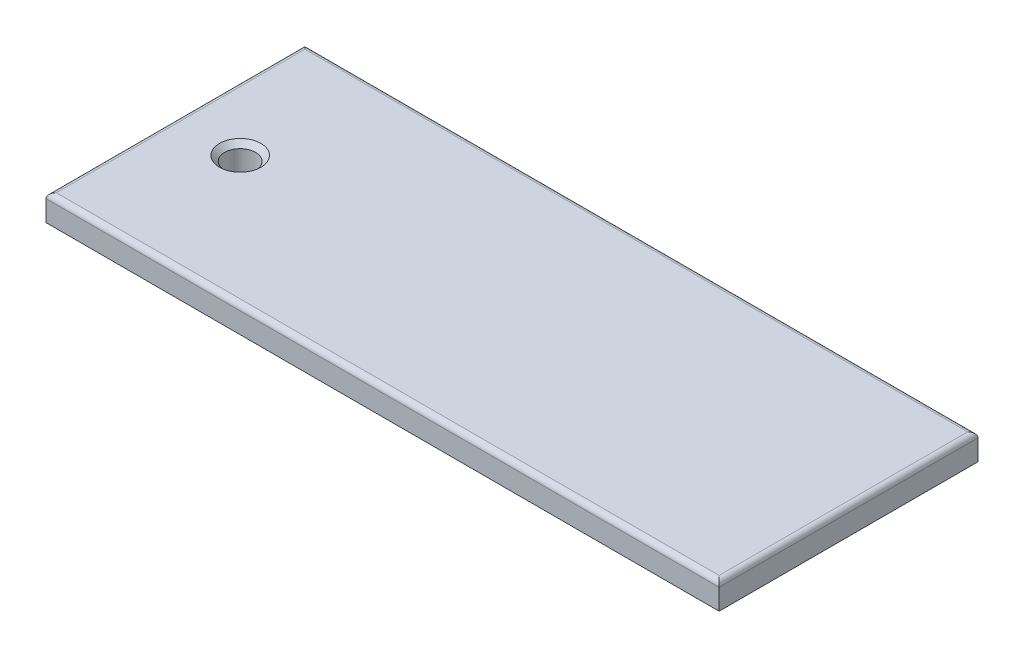
ISO-10303-21;
HEADER;
FILE_DESCRIPTION(('STEP AP214'),'2;1');
FILE_NAME('part.step','',(''),(''),'','','');
FILE_SCHEMA(('AUTOMOTIVE_DESIGN { 1 0 10303 214 1 1 1 1 }'));
ENDSEC;
DATA;
#1=APPLICATION_CONTEXT('core data for automotive mechanical design processes');
#2=APPLICATION_PROTOCOL_DEFINITION('international standard','automotive_design',2000,#1);
#3=PRODUCT_CONTEXT('',#1,'mechanical');
#4=PRODUCT('Part','Part','',(#3));
#5=PRODUCT_RELATED_PRODUCT_CATEGORY('part','',(#4));
#6=PRODUCT_DEFINITION_FORMATION('','',#4);
#7=PRODUCT_DEFINITION_CONTEXT('part definition',#1,'design');
#8=PRODUCT_DEFINITION('design','',#6,#7);
#9=PRODUCT_DEFINITION_SHAPE('','',#8);
#10=(LENGTH_UNIT() NAMED_UNIT(*) SI_UNIT(.MILLI.,.METRE.));
#11=(NAMED_UNIT(*) PLANE_ANGLE_UNIT() SI_UNIT($,.RADIAN.));
#12=(NAMED_UNIT(*) SI_UNIT($,.STERADIAN.) SOLID_ANGLE_UNIT());
#13=UNCERTAINTY_MEASURE_WITH_UNIT(LENGTH_MEASURE(1.E-05),#10,'distance_accuracy_value','');
#14=(GEOMETRIC_REPRESENTATION_CONTEXT(3) GLOBAL_UNCERTAINTY_ASSIGNED_CONTEXT((#13)) GLOBAL_UNIT_ASSIGNED_CONTEXT((#10,
#11,#12)) REPRESENTATION_CONTEXT('',''));
#15=CARTESIAN_POINT('',(0.,0.,0.));
#16=DIRECTION('',(0.,0.,1.));
#17=DIRECTION('',(1.,0.,0.));
#18=AXIS2_PLACEMENT_3D('',#15,#16,#17);
#19=CARTESIAN_POINT('',(-130.,10.,50.));
#20=DIRECTION('',(1.,0.,0.));
#21=DIRECTION('',(0.,0.,-1.));
#22=AXIS2_PLACEMENT_3D('',#19,#20,#21);
#23=PLANE('',#22);
#24=DIRECTION('',(0.,-1.,0.));
#25=VECTOR('',#24,1.);
#26=CARTESIAN_POINT('',(-130.,10.,50.));
#27=LINE('',#26,#25);
#28=CARTESIAN_POINT('',(-130.,8.,50.));
#29=VERTEX_POINT('',#28);
#30=CARTESIAN_POINT('',(-130.,0.,50.));
#31=VERTEX_POINT('',#30);
#32=EDGE_CURVE('E99',#29,#31,#27,.T.);
#33=ORIENTED_EDGE('',*,*,#32,.F.);
#34=DIRECTION('',(0.,0.,1.));
#35=VECTOR('',#34,1.);
#36=CARTESIAN_POINT('',(-130.,8.,-50.));
#37=LINE('',#36,#35);
#38=CARTESIAN_POINT('',(-130.,8.,-50.));
#39=VERTEX_POINT('',#38);
#40=EDGE_CURVE('E159',#29,#39,#37,.F.);
#41=ORIENTED_EDGE('',*,*,#40,.T.);
#42=DIRECTION('',(0.,-1.,0.));
#43=VECTOR('',#42,1.);
#44=CARTESIAN_POINT('',(-130.,10.,-50.));
#45=LINE('',#44,#43);
#46=CARTESIAN_POINT('',(-130.,0.,-50.));
#47=VERTEX_POINT('',#46);
#48=EDGE_CURVE('E123',#39,#47,#45,.T.);
#49=ORIENTED_EDGE('',*,*,#48,.T.);
#50=DIRECTION('',(0.,0.,1.));
#51=VECTOR('',#50,1.);
#52=CARTESIAN_POINT('',(-130.,0.,50.));
#53=LINE('',#52,#51);
#54=EDGE_CURVE('E118',#47,#31,#53,.T.);
#55=ORIENTED_EDGE('',*,*,#54,.T.);
#56=EDGE_LOOP('',(#33,#41,#49,#55));
#57=FACE_BOUND('',#56,.T.);
#58=ADVANCED_FACE('F44',(#57),#23,.F.);
#59=CARTESIAN_POINT('',(130.,10.,50.));
#60=DIRECTION('',(0.,0.,-1.));
#61=DIRECTION('',(-1.,0.,0.));
#62=AXIS2_PLACEMENT_3D('',#59,#60,#61);
#63=PLANE('',#62);
#64=DIRECTION('',(0.,-1.,0.));
#65=VECTOR('',#64,1.);
#66=CARTESIAN_POINT('',(130.,10.,50.));
#67=LINE('',#66,#65);
#68=CARTESIAN_POINT('',(130.,8.,50.));
#69=VERTEX_POINT('',#68);
#70=CARTESIAN_POINT('',(130.,0.,50.));
#71=VERTEX_POINT('',#70);
#72=EDGE_CURVE('E112',#69,#71,#67,.T.);
#73=ORIENTED_EDGE('',*,*,#72,.F.);
#74=DIRECTION('',(1.,0.,0.));
#75=VECTOR('',#74,1.);
#76=CARTESIAN_POINT('',(-130.,8.,50.));
#77=LINE('',#76,#75);
#78=EDGE_CURVE('E105',#69,#29,#77,.F.);
#79=ORIENTED_EDGE('',*,*,#78,.T.);
#80=ORIENTED_EDGE('',*,*,#32,.T.);
#81=DIRECTION('',(1.,0.,0.));
#82=VECTOR('',#81,1.);
#83=CARTESIAN_POINT('',(130.,0.,50.));
#84=LINE('',#83,#82);
#85=EDGE_CURVE('E102',#31,#71,#84,.T.);
#86=ORIENTED_EDGE('',*,*,#85,.T.);
#87=EDGE_LOOP('',(#73,#79,#80,#86));
#88=FACE_BOUND('',#87,.T.);
#89=ADVANCED_FACE('F101',(#88),#63,.F.);
#90=CARTESIAN_POINT('',(130.,10.,50.));
#91=DIRECTION('',(-1.,0.,0.));
#92=DIRECTION('',(0.,0.,1.));
#93=AXIS2_PLACEMENT_3D('',#90,#91,#92);
#94=PLANE('',#93);
#95=DIRECTION('',(0.,-1.,0.));
#96=VECTOR('',#95,1.);
#97=CARTESIAN_POINT('',(130.,10.,-50.));
#98=LINE('',#97,#96);
#99=CARTESIAN_POINT('',(130.,8.,-50.));
#100=VERTEX_POINT('',#99);
#101=CARTESIAN_POINT('',(130.,0.,-50.));
#102=VERTEX_POINT('',#101);
#103=EDGE_CURVE('E142',#100,#102,#98,.T.);
#104=ORIENTED_EDGE('',*,*,#103,.F.);
#105=DIRECTION('',(0.,0.,-1.));
#106=VECTOR('',#105,1.);
#107=CARTESIAN_POINT('',(130.,8.,50.));
#108=LINE('',#107,#106);
#109=EDGE_CURVE('E60',#100,#69,#108,.F.);
#110=ORIENTED_EDGE('',*,*,#109,.T.);
#111=ORIENTED_EDGE('',*,*,#72,.T.);
#112=DIRECTION('',(0.,0.,-1.));
#113=VECTOR('',#112,1.);
#114=CARTESIAN_POINT('',(130.,0.,50.));
#115=LINE('',#114,#113);
#116=EDGE_CURVE('E120',#71,#102,#115,.T.);
#117=ORIENTED_EDGE('',*,*,#116,.T.);
#118=EDGE_LOOP('',(#104,#110,#111,#117));
#119=FACE_BOUND('',#118,.T.);
#120=ADVANCED_FACE('F196',(#119),#94,.F.);
#121=CARTESIAN_POINT('',(130.,10.,-50.));
#122=DIRECTION('',(0.,0.,1.));
#123=DIRECTION('',(1.,0.,0.));
#124=AXIS2_PLACEMENT_3D('',#121,#122,#123);
#125=PLANE('',#124);
#126=ORIENTED_EDGE('',*,*,#48,.F.);
#127=DIRECTION('',(-1.,0.,0.));
#128=VECTOR('',#127,1.);
#129=CARTESIAN_POINT('',(130.,8.,-50.));
#130=LINE('',#129,#128);
#131=EDGE_CURVE('E68',#39,#100,#130,.F.);
#132=ORIENTED_EDGE('',*,*,#131,.T.);
#133=ORIENTED_EDGE('',*,*,#103,.T.);
#134=DIRECTION('',(-1.,0.,0.));
#135=VECTOR('',#134,1.);
#136=CARTESIAN_POINT('',(130.,0.,-50.));
#137=LINE('',#136,#135);
#138=EDGE_CURVE('E137',#102,#47,#137,.T.);
#139=ORIENTED_EDGE('',*,*,#138,.T.);
#140=EDGE_LOOP('',(#126,#132,#133,#139));
#141=FACE_BOUND('',#140,.T.);
#142=ADVANCED_FACE('F226',(#141),#125,.F.);
#143=CARTESIAN_POINT('',(0.,10.,0.));
#144=DIRECTION('',(0.,1.,0.));
#145=DIRECTION('',(0.,0.,1.));
#146=AXIS2_PLACEMENT_3D('',#143,#144,#145);
#147=PLANE('',#146);
#148=CARTESIAN_POINT('',(-105.,10.,0.));
#149=DIRECTION('',(0.,1.,0.));
#150=DIRECTION('',(0.,0.,1.));
#151=AXIS2_PLACEMENT_3D('',#148,#149,#150);
#152=CIRCLE('',#151,8.00000000000001);
#153=CARTESIAN_POINT('',(-105.,10.,8.00000000000001));
#154=VERTEX_POINT('',#153);
#155=EDGE_CURVE('E11',#154,#154,#152,.F.);
#156=ORIENTED_EDGE('',*,*,#155,.T.);
#157=EDGE_LOOP('',(#156));
#158=FACE_BOUND('',#157,.T.);
#159=DIRECTION('',(-1.,0.,0.));
#160=VECTOR('',#159,1.);
#161=CARTESIAN_POINT('',(-130.,10.,-48.));
#162=LINE('',#161,#160);
#163=CARTESIAN_POINT('',(128.,10.,-48.));
#164=VERTEX_POINT('',#163);
#165=CARTESIAN_POINT('',(-128.,10.,-48.));
#166=VERTEX_POINT('',#165);
#167=EDGE_CURVE('E152',#164,#166,#162,.T.);
#168=ORIENTED_EDGE('',*,*,#167,.T.);
#169=DIRECTION('',(0.,0.,1.));
#170=VECTOR('',#169,1.);
#171=CARTESIAN_POINT('',(-128.,10.,50.));
#172=LINE('',#171,#170);
#173=CARTESIAN_POINT('',(-128.,10.,48.));
#174=VERTEX_POINT('',#173);
#175=EDGE_CURVE('E155',#166,#174,#172,.T.);
#176=ORIENTED_EDGE('',*,*,#175,.T.);
#177=DIRECTION('',(1.,0.,0.));
#178=VECTOR('',#177,1.);
#179=CARTESIAN_POINT('',(130.,10.,48.));
#180=LINE('',#179,#178);
#181=CARTESIAN_POINT('',(128.,10.,48.));
#182=VERTEX_POINT('',#181);
#183=EDGE_CURVE('E111',#174,#182,#180,.T.);
#184=ORIENTED_EDGE('',*,*,#183,.T.);
#185=DIRECTION('',(0.,0.,-1.));
#186=VECTOR('',#185,1.);
#187=CARTESIAN_POINT('',(128.,10.,-50.));
#188=LINE('',#187,#186);
#189=EDGE_CURVE('E149',#182,#164,#188,.T.);
#190=ORIENTED_EDGE('',*,*,#189,.T.);
#191=EDGE_LOOP('',(#168,#176,#184,#190));
#192=FACE_BOUND('',#191,.T.);
#193=ADVANCED_FACE('F216',(#158,#192),#147,.T.);
#194=CARTESIAN_POINT('',(0.,0.,0.));
#195=DIRECTION('',(0.,1.,0.));
#196=DIRECTION('',(0.,0.,1.));
#197=AXIS2_PLACEMENT_3D('',#194,#195,#196);
#198=PLANE('',#197);
#199=CARTESIAN_POINT('',(-105.,0.,0.));
#200=DIRECTION('',(0.,1.,0.));
#201=DIRECTION('',(0.,0.,1.));
#202=AXIS2_PLACEMENT_3D('',#199,#200,#201);
#203=CIRCLE('',#202,6.00000000000002);
#204=CARTESIAN_POINT('',(-105.,0.,6.00000000000002));
#205=VERTEX_POINT('',#204);
#206=EDGE_CURVE('E133',#205,#205,#203,.T.);
#207=ORIENTED_EDGE('',*,*,#206,.T.);
#208=EDGE_LOOP('',(#207));
#209=FACE_BOUND('',#208,.T.);
#210=ORIENTED_EDGE('',*,*,#54,.F.);
#211=ORIENTED_EDGE('',*,*,#138,.F.);
#212=ORIENTED_EDGE('',*,*,#116,.F.);
#213=ORIENTED_EDGE('',*,*,#85,.F.);
#214=EDGE_LOOP('',(#210,#211,#212,#213));
#215=FACE_BOUND('',#214,.T.);
#216=ADVANCED_FACE('F116',(#209,#215),#198,.F.);
#217=CARTESIAN_POINT('',(128.,8.,0.));
#218=DIRECTION('',(0.,0.,1.));
#219=DIRECTION('',(1.,0.,0.));
#220=AXIS2_PLACEMENT_3D('',#217,#218,#219);
#221=CYLINDRICAL_SURFACE('',#220,2.);
#222=CARTESIAN_POINT('',(128.,8.,48.));
#223=DIRECTION('',(-0.707106781186547,0.,0.707106781186547));
#224=DIRECTION('',(-0.707106781186547,0.,-0.707106781186547));
#225=AXIS2_PLACEMENT_3D('',#222,#223,#224);
#226=ELLIPSE('',#225,2.82842712474619,2.);
#227=EDGE_CURVE('E130',#69,#182,#226,.T.);
#228=ORIENTED_EDGE('',*,*,#227,.F.);
#229=ORIENTED_EDGE('',*,*,#109,.F.);
#230=CARTESIAN_POINT('',(128.,8.,-48.));
#231=DIRECTION('',(0.707106781186547,0.,0.707106781186547));
#232=DIRECTION('',(-0.707106781186547,0.,0.707106781186547));
#233=AXIS2_PLACEMENT_3D('',#230,#231,#232);
#234=ELLIPSE('',#233,2.82842712474619,2.);
#235=EDGE_CURVE('E126',#164,#100,#234,.F.);
#236=ORIENTED_EDGE('',*,*,#235,.F.);
#237=ORIENTED_EDGE('',*,*,#189,.F.);
#238=EDGE_LOOP('',(#228,#229,#236,#237));
#239=FACE_BOUND('',#238,.T.);
#240=ADVANCED_FACE('F209',(#239),#221,.T.);
#241=CARTESIAN_POINT('',(0.,8.,-48.));
#242=DIRECTION('',(1.,0.,0.));
#243=DIRECTION('',(0.,0.,-1.));
#244=AXIS2_PLACEMENT_3D('',#241,#242,#243);
#245=CYLINDRICAL_SURFACE('',#244,2.);
#246=ORIENTED_EDGE('',*,*,#235,.T.);
#247=ORIENTED_EDGE('',*,*,#131,.F.);
#248=CARTESIAN_POINT('',(-128.,8.,-48.));
#249=DIRECTION('',(0.707106781186547,0.,-0.707106781186547));
#250=DIRECTION('',(0.707106781186547,0.,0.707106781186547));
#251=AXIS2_PLACEMENT_3D('',#248,#249,#250);
#252=ELLIPSE('',#251,2.82842712474619,2.);
#253=EDGE_CURVE('E171',#166,#39,#252,.F.);
#254=ORIENTED_EDGE('',*,*,#253,.F.);
#255=ORIENTED_EDGE('',*,*,#167,.F.);
#256=EDGE_LOOP('',(#246,#247,#254,#255));
#257=FACE_BOUND('',#256,.T.);
#258=ADVANCED_FACE('F206',(#257),#245,.T.);
#259=CARTESIAN_POINT('',(0.,8.,48.));
#260=DIRECTION('',(-1.,0.,0.));
#261=DIRECTION('',(0.,0.,1.));
#262=AXIS2_PLACEMENT_3D('',#259,#260,#261);
#263=CYLINDRICAL_SURFACE('',#262,2.);
#264=ORIENTED_EDGE('',*,*,#227,.T.);
#265=ORIENTED_EDGE('',*,*,#183,.F.);
#266=CARTESIAN_POINT('',(-128.,8.,48.));
#267=DIRECTION('',(-0.707106781186547,0.,-0.707106781186547));
#268=DIRECTION('',(-0.707106781186547,0.,0.707106781186547));
#269=AXIS2_PLACEMENT_3D('',#266,#267,#268);
#270=ELLIPSE('',#269,2.82842712474619,2.);
#271=EDGE_CURVE('E168',#29,#174,#270,.T.);
#272=ORIENTED_EDGE('',*,*,#271,.F.);
#273=ORIENTED_EDGE('',*,*,#78,.F.);
#274=EDGE_LOOP('',(#264,#265,#272,#273));
#275=FACE_BOUND('',#274,.T.);
#276=ADVANCED_FACE('F202',(#275),#263,.T.);
#277=CARTESIAN_POINT('',(-128.,8.,0.));
#278=DIRECTION('',(0.,0.,-1.));
#279=DIRECTION('',(-1.,0.,0.));
#280=AXIS2_PLACEMENT_3D('',#277,#278,#279);
#281=CYLINDRICAL_SURFACE('',#280,2.);
#282=ORIENTED_EDGE('',*,*,#253,.T.);
#283=ORIENTED_EDGE('',*,*,#40,.F.);
#284=ORIENTED_EDGE('',*,*,#271,.T.);
#285=ORIENTED_EDGE('',*,*,#175,.F.);
#286=EDGE_LOOP('',(#282,#283,#284,#285));
#287=FACE_BOUND('',#286,.T.);
#288=ADVANCED_FACE('F188',(#287),#281,.T.);
#289=CARTESIAN_POINT('',(-105.,0.,0.));
#290=DIRECTION('',(0.,1.,0.));
#291=DIRECTION('',(0.,0.,1.));
#292=AXIS2_PLACEMENT_3D('',#289,#290,#291);
#293=CYLINDRICAL_SURFACE('',#292,6.00000000000002);
#294=CARTESIAN_POINT('',(-105.,7.99999999999999,0.));
#295=DIRECTION('',(0.,1.,0.));
#296=DIRECTION('',(0.,0.,1.));
#297=AXIS2_PLACEMENT_3D('',#294,#295,#296);
#298=CIRCLE('',#297,6.00000000000002);
#299=CARTESIAN_POINT('',(-105.,7.99999999999999,6.00000000000002));
#300=VERTEX_POINT('',#299);
#301=EDGE_CURVE('E53',#300,#300,#298,.T.);
#302=ORIENTED_EDGE('',*,*,#301,.T.);
#303=EDGE_LOOP('',(#302));
#304=FACE_BOUND('',#303,.T.);
#305=ORIENTED_EDGE('',*,*,#206,.F.);
#306=EDGE_LOOP('',(#305));
#307=FACE_BOUND('',#306,.T.);
#308=ADVANCED_FACE('F180',(#304,#307),#293,.F.);
#309=CARTESIAN_POINT('',(-105.,7.99999999999999,0.));
#310=DIRECTION('',(0.,1.,0.));
#311=DIRECTION('',(0.,0.,1.));
#312=AXIS2_PLACEMENT_3D('',#309,#310,#311);
#313=CONICAL_SURFACE('',#312,6.00000000000002,0.785398163397443);
#314=ORIENTED_EDGE('',*,*,#155,.F.);
#315=EDGE_LOOP('',(#314));
#316=FACE_BOUND('',#315,.T.);
#317=ORIENTED_EDGE('',*,*,#301,.F.);
#318=EDGE_LOOP('',(#317));
#319=FACE_BOUND('',#318,.T.);
#320=ADVANCED_FACE('F46',(#316,#319),#313,.F.);
#321=CLOSED_SHELL('',(#58,#89,#120,#142,#193,#216,#240,#258,#276,#288,#308,#320));
#322=MANIFOLD_SOLID_BREP('B2',#321);
#323=ADVANCED_BREP_SHAPE_REPRESENTATION('',(#18,#322),#14);
#324=SHAPE_DEFINITION_REPRESENTATION(#9,#323);
ENDSEC;
END-ISO-10303-21;
